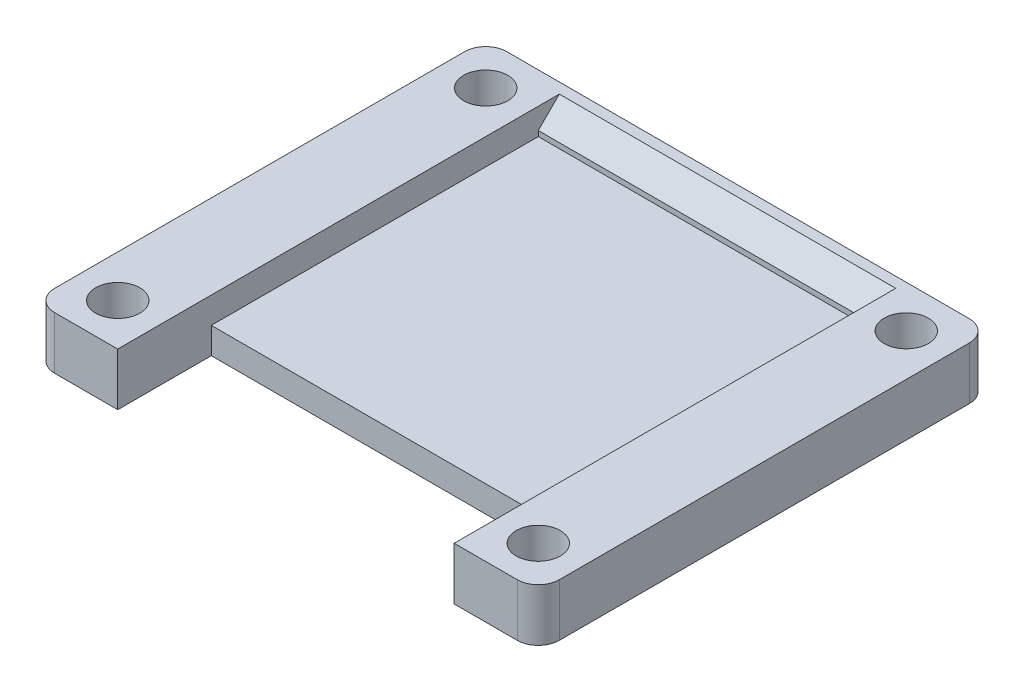
ISO-10303-21;
HEADER;
FILE_DESCRIPTION(('STEP AP214'),'2;1');
FILE_NAME('part.step','',(''),(''),'','','');
FILE_SCHEMA(('AUTOMOTIVE_DESIGN { 1 0 10303 214 1 1 1 1 }'));
ENDSEC;
DATA;
#1=APPLICATION_CONTEXT('core data for automotive mechanical design processes');
#2=APPLICATION_PROTOCOL_DEFINITION('international standard','automotive_design',2000,#1);
#3=PRODUCT_CONTEXT('',#1,'mechanical');
#4=PRODUCT('Part','Part','',(#3));
#5=PRODUCT_RELATED_PRODUCT_CATEGORY('part','',(#4));
#6=PRODUCT_DEFINITION_FORMATION('','',#4);
#7=PRODUCT_DEFINITION_CONTEXT('part definition',#1,'design');
#8=PRODUCT_DEFINITION('design','',#6,#7);
#9=PRODUCT_DEFINITION_SHAPE('','',#8);
#10=(LENGTH_UNIT() NAMED_UNIT(*) SI_UNIT(.MILLI.,.METRE.));
#11=(NAMED_UNIT(*) PLANE_ANGLE_UNIT() SI_UNIT($,.RADIAN.));
#12=(NAMED_UNIT(*) SI_UNIT($,.STERADIAN.) SOLID_ANGLE_UNIT());
#13=UNCERTAINTY_MEASURE_WITH_UNIT(LENGTH_MEASURE(1.E-05),#10,'distance_accuracy_value','');
#14=(GEOMETRIC_REPRESENTATION_CONTEXT(3) GLOBAL_UNCERTAINTY_ASSIGNED_CONTEXT((#13)) GLOBAL_UNIT_ASSIGNED_CONTEXT((#10,
#11,#12)) REPRESENTATION_CONTEXT('',''));
#15=CARTESIAN_POINT('',(0.,0.,0.));
#16=DIRECTION('',(0.,0.,1.));
#17=DIRECTION('',(1.,0.,0.));
#18=AXIS2_PLACEMENT_3D('',#15,#16,#17);
#19=CARTESIAN_POINT('',(-48.,-5.,0.));
#20=DIRECTION('',(0.,0.,1.));
#21=DIRECTION('',(1.,0.,0.));
#22=AXIS2_PLACEMENT_3D('',#19,#20,#21);
#23=PLANE('',#22);
#24=DIRECTION('',(1.,0.,0.));
#25=VECTOR('',#24,1.);
#26=CARTESIAN_POINT('',(-48.,-5.,0.));
#27=LINE('',#26,#25);
#28=CARTESIAN_POINT('',(-46.,-5.,0.));
#29=VERTEX_POINT('',#28);
#30=CARTESIAN_POINT('',(-40.,-5.,0.));
#31=VERTEX_POINT('',#30);
#32=EDGE_CURVE('E158',#29,#31,#27,.T.);
#33=ORIENTED_EDGE('',*,*,#32,.T.);
#34=DIRECTION('',(0.,1.,0.));
#35=VECTOR('',#34,1.);
#36=CARTESIAN_POINT('',(-40.,-2.5,0.));
#37=LINE('',#36,#35);
#38=CARTESIAN_POINT('',(-40.,0.,0.));
#39=VERTEX_POINT('',#38);
#40=EDGE_CURVE('E144',#31,#39,#37,.T.);
#41=ORIENTED_EDGE('',*,*,#40,.T.);
#42=DIRECTION('',(1.,0.,0.));
#43=VECTOR('',#42,1.);
#44=CARTESIAN_POINT('',(-48.,0.,0.));
#45=LINE('',#44,#43);
#46=CARTESIAN_POINT('',(-46.,0.,0.));
#47=VERTEX_POINT('',#46);
#48=EDGE_CURVE('E185',#47,#39,#45,.T.);
#49=ORIENTED_EDGE('',*,*,#48,.F.);
#50=DIRECTION('',(0.,1.,0.));
#51=VECTOR('',#50,1.);
#52=CARTESIAN_POINT('',(-46.,-5.,0.));
#53=LINE('',#52,#51);
#54=EDGE_CURVE('E167',#47,#29,#53,.F.);
#55=ORIENTED_EDGE('',*,*,#54,.T.);
#56=EDGE_LOOP('',(#33,#41,#49,#55));
#57=FACE_BOUND('',#56,.T.);
#58=ADVANCED_FACE('F37',(#57),#23,.T.);
#59=CARTESIAN_POINT('',(-48.,-5.,-43.));
#60=DIRECTION('',(-1.,0.,0.));
#61=DIRECTION('',(0.,0.,1.));
#62=AXIS2_PLACEMENT_3D('',#59,#60,#61);
#63=PLANE('',#62);
#64=DIRECTION('',(0.,0.,1.));
#65=VECTOR('',#64,1.);
#66=CARTESIAN_POINT('',(-48.,-5.,-43.));
#67=LINE('',#66,#65);
#68=CARTESIAN_POINT('',(-48.,-5.,-41.));
#69=VERTEX_POINT('',#68);
#70=CARTESIAN_POINT('',(-48.,-5.,-2.00000000000001));
#71=VERTEX_POINT('',#70);
#72=EDGE_CURVE('E174',#69,#71,#67,.T.);
#73=ORIENTED_EDGE('',*,*,#72,.T.);
#74=DIRECTION('',(0.,1.,0.));
#75=VECTOR('',#74,1.);
#76=CARTESIAN_POINT('',(-48.,-5.,-2.00000000000001));
#77=LINE('',#76,#75);
#78=CARTESIAN_POINT('',(-48.,0.,-2.00000000000001));
#79=VERTEX_POINT('',#78);
#80=EDGE_CURVE('E194',#71,#79,#77,.T.);
#81=ORIENTED_EDGE('',*,*,#80,.T.);
#82=DIRECTION('',(0.,0.,1.));
#83=VECTOR('',#82,1.);
#84=CARTESIAN_POINT('',(-48.,0.,-43.));
#85=LINE('',#84,#83);
#86=CARTESIAN_POINT('',(-48.,0.,-41.));
#87=VERTEX_POINT('',#86);
#88=EDGE_CURVE('E180',#87,#79,#85,.T.);
#89=ORIENTED_EDGE('',*,*,#88,.F.);
#90=DIRECTION('',(0.,1.,0.));
#91=VECTOR('',#90,1.);
#92=CARTESIAN_POINT('',(-48.,-5.,-41.));
#93=LINE('',#92,#91);
#94=EDGE_CURVE('E179',#87,#69,#93,.F.);
#95=ORIENTED_EDGE('',*,*,#94,.T.);
#96=EDGE_LOOP('',(#73,#81,#89,#95));
#97=FACE_BOUND('',#96,.T.);
#98=ADVANCED_FACE('F273',(#97),#63,.T.);
#99=CARTESIAN_POINT('',(-48.,-5.,-43.));
#100=DIRECTION('',(0.,0.,-1.));
#101=DIRECTION('',(-1.,0.,0.));
#102=AXIS2_PLACEMENT_3D('',#99,#100,#101);
#103=PLANE('',#102);
#104=DIRECTION('',(-1.,0.,0.));
#105=VECTOR('',#104,1.);
#106=CARTESIAN_POINT('',(-48.,0.,-43.));
#107=LINE('',#106,#105);
#108=CARTESIAN_POINT('',(-2.,0.,-43.));
#109=VERTEX_POINT('',#108);
#110=CARTESIAN_POINT('',(-46.,0.,-43.));
#111=VERTEX_POINT('',#110);
#112=EDGE_CURVE('E190',#109,#111,#107,.T.);
#113=ORIENTED_EDGE('',*,*,#112,.F.);
#114=DIRECTION('',(0.,1.,0.));
#115=VECTOR('',#114,1.);
#116=CARTESIAN_POINT('',(-2.,-5.,-43.));
#117=LINE('',#116,#115);
#118=CARTESIAN_POINT('',(-2.,-5.,-43.));
#119=VERTEX_POINT('',#118);
#120=EDGE_CURVE('E226',#109,#119,#117,.F.);
#121=ORIENTED_EDGE('',*,*,#120,.T.);
#122=DIRECTION('',(-1.,0.,0.));
#123=VECTOR('',#122,1.);
#124=CARTESIAN_POINT('',(-48.,-5.,-43.));
#125=LINE('',#124,#123);
#126=CARTESIAN_POINT('',(-46.,-5.,-43.));
#127=VERTEX_POINT('',#126);
#128=EDGE_CURVE('E172',#119,#127,#125,.T.);
#129=ORIENTED_EDGE('',*,*,#128,.T.);
#130=DIRECTION('',(0.,1.,0.));
#131=VECTOR('',#130,1.);
#132=CARTESIAN_POINT('',(-46.,-5.,-43.));
#133=LINE('',#132,#131);
#134=EDGE_CURVE('E223',#127,#111,#133,.T.);
#135=ORIENTED_EDGE('',*,*,#134,.T.);
#136=EDGE_LOOP('',(#113,#121,#129,#135));
#137=FACE_BOUND('',#136,.T.);
#138=ADVANCED_FACE('F263',(#137),#103,.T.);
#139=CARTESIAN_POINT('',(0.,-5.,-43.));
#140=DIRECTION('',(1.,0.,0.));
#141=DIRECTION('',(0.,0.,-1.));
#142=AXIS2_PLACEMENT_3D('',#139,#140,#141);
#143=PLANE('',#142);
#144=DIRECTION('',(0.,0.,-1.));
#145=VECTOR('',#144,1.);
#146=CARTESIAN_POINT('',(0.,0.,-43.));
#147=LINE('',#146,#145);
#148=CARTESIAN_POINT('',(0.,0.,-2.));
#149=VERTEX_POINT('',#148);
#150=CARTESIAN_POINT('',(0.,0.,-41.));
#151=VERTEX_POINT('',#150);
#152=EDGE_CURVE('E187',#149,#151,#147,.T.);
#153=ORIENTED_EDGE('',*,*,#152,.F.);
#154=DIRECTION('',(0.,1.,0.));
#155=VECTOR('',#154,1.);
#156=CARTESIAN_POINT('',(0.,-5.,-2.));
#157=LINE('',#156,#155);
#158=CARTESIAN_POINT('',(0.,-5.,-2.));
#159=VERTEX_POINT('',#158);
#160=EDGE_CURVE('E221',#149,#159,#157,.F.);
#161=ORIENTED_EDGE('',*,*,#160,.T.);
#162=DIRECTION('',(0.,0.,-1.));
#163=VECTOR('',#162,1.);
#164=CARTESIAN_POINT('',(0.,-5.,-43.));
#165=LINE('',#164,#163);
#166=CARTESIAN_POINT('',(0.,-5.,-41.));
#167=VERTEX_POINT('',#166);
#168=EDGE_CURVE('E168',#159,#167,#165,.T.);
#169=ORIENTED_EDGE('',*,*,#168,.T.);
#170=DIRECTION('',(0.,1.,0.));
#171=VECTOR('',#170,1.);
#172=CARTESIAN_POINT('',(0.,-5.,-41.));
#173=LINE('',#172,#171);
#174=EDGE_CURVE('E218',#167,#151,#173,.T.);
#175=ORIENTED_EDGE('',*,*,#174,.T.);
#176=EDGE_LOOP('',(#153,#161,#169,#175));
#177=FACE_BOUND('',#176,.T.);
#178=ADVANCED_FACE('F254',(#177),#143,.T.);
#179=DIRECTION('',(0.,1.,0.));
#180=VECTOR('',#179,1.);
#181=CARTESIAN_POINT('',(-7.99999999999999,-2.5,0.));
#182=LINE('',#181,#180);
#183=CARTESIAN_POINT('',(-8.,-5.,0.));
#184=VERTEX_POINT('',#183);
#185=CARTESIAN_POINT('',(-8.00000000000001,0.,0.));
#186=VERTEX_POINT('',#185);
#187=EDGE_CURVE('E152',#184,#186,#182,.T.);
#188=ORIENTED_EDGE('',*,*,#187,.F.);
#189=CARTESIAN_POINT('',(-2.00000000000002,-5.,0.));
#190=VERTEX_POINT('',#189);
#191=EDGE_CURVE('E169',#184,#190,#27,.T.);
#192=ORIENTED_EDGE('',*,*,#191,.T.);
#193=DIRECTION('',(0.,1.,0.));
#194=VECTOR('',#193,1.);
#195=CARTESIAN_POINT('',(-2.,-5.,0.));
#196=LINE('',#195,#194);
#197=CARTESIAN_POINT('',(-2.00000000000002,0.,0.));
#198=VERTEX_POINT('',#197);
#199=EDGE_CURVE('E205',#190,#198,#196,.T.);
#200=ORIENTED_EDGE('',*,*,#199,.T.);
#201=EDGE_CURVE('E183',#186,#198,#45,.T.);
#202=ORIENTED_EDGE('',*,*,#201,.F.);
#203=EDGE_LOOP('',(#188,#192,#200,#202));
#204=FACE_BOUND('',#203,.T.);
#205=ADVANCED_FACE('F244',(#204),#23,.T.);
#206=CARTESIAN_POINT('',(0.,-5.,0.));
#207=DIRECTION('',(0.,1.,0.));
#208=DIRECTION('',(0.,0.,1.));
#209=AXIS2_PLACEMENT_3D('',#206,#207,#208);
#210=PLANE('',#209);
#211=CARTESIAN_POINT('',(-44.,-5.,-4.00000000000001));
#212=DIRECTION('',(0.,1.,0.));
#213=DIRECTION('',(0.,0.,-1.));
#214=AXIS2_PLACEMENT_3D('',#211,#212,#213);
#215=CIRCLE('',#214,2.09999999999999);
#216=CARTESIAN_POINT('',(-44.,-5.,-6.1));
#217=VERTEX_POINT('',#216);
#218=EDGE_CURVE('E301',#217,#217,#215,.T.);
#219=ORIENTED_EDGE('',*,*,#218,.T.);
#220=EDGE_LOOP('',(#219));
#221=FACE_BOUND('',#220,.T.);
#222=CARTESIAN_POINT('',(-4.00000000000001,-5.,-3.99999999999999));
#223=DIRECTION('',(0.,1.,0.));
#224=DIRECTION('',(0.,0.,1.));
#225=AXIS2_PLACEMENT_3D('',#222,#223,#224);
#226=CIRCLE('',#225,2.1);
#227=CARTESIAN_POINT('',(-4.00000000000001,-5.,-1.89999999999999));
#228=VERTEX_POINT('',#227);
#229=EDGE_CURVE('E295',#228,#228,#226,.T.);
#230=ORIENTED_EDGE('',*,*,#229,.T.);
#231=EDGE_LOOP('',(#230));
#232=FACE_BOUND('',#231,.T.);
#233=CARTESIAN_POINT('',(-4.,-5.,-39.));
#234=DIRECTION('',(0.,1.,0.));
#235=DIRECTION('',(0.,0.,-1.));
#236=AXIS2_PLACEMENT_3D('',#233,#234,#235);
#237=CIRCLE('',#236,2.1);
#238=CARTESIAN_POINT('',(-4.,-5.,-41.1));
#239=VERTEX_POINT('',#238);
#240=EDGE_CURVE('E288',#239,#239,#237,.T.);
#241=ORIENTED_EDGE('',*,*,#240,.T.);
#242=EDGE_LOOP('',(#241));
#243=FACE_BOUND('',#242,.T.);
#244=CARTESIAN_POINT('',(-44.,-5.,-39.));
#245=DIRECTION('',(0.,1.,0.));
#246=DIRECTION('',(0.,0.,1.));
#247=AXIS2_PLACEMENT_3D('',#244,#245,#246);
#248=CIRCLE('',#247,2.1);
#249=CARTESIAN_POINT('',(-44.,-5.,-36.9));
#250=VERTEX_POINT('',#249);
#251=EDGE_CURVE('E306',#250,#250,#248,.T.);
#252=ORIENTED_EDGE('',*,*,#251,.T.);
#253=EDGE_LOOP('',(#252));
#254=FACE_BOUND('',#253,.T.);
#255=DIRECTION('',(-1.,0.,0.));
#256=VECTOR('',#255,1.);
#257=CARTESIAN_POINT('',(-40.,-5.,-8.9));
#258=LINE('',#257,#256);
#259=CARTESIAN_POINT('',(-7.99999999999999,-5.,-8.9));
#260=VERTEX_POINT('',#259);
#261=CARTESIAN_POINT('',(-40.,-5.,-8.9));
#262=VERTEX_POINT('',#261);
#263=EDGE_CURVE('E162',#260,#262,#258,.T.);
#264=ORIENTED_EDGE('',*,*,#263,.T.);
#265=DIRECTION('',(0.,0.,1.));
#266=VECTOR('',#265,1.);
#267=CARTESIAN_POINT('',(-40.,-5.,0.));
#268=LINE('',#267,#266);
#269=EDGE_CURVE('E147',#262,#31,#268,.T.);
#270=ORIENTED_EDGE('',*,*,#269,.T.);
#271=ORIENTED_EDGE('',*,*,#32,.F.);
#272=CARTESIAN_POINT('',(-46.,-5.,-2.00000000000001));
#273=DIRECTION('',(0.,1.,0.));
#274=DIRECTION('',(0.,0.,1.));
#275=AXIS2_PLACEMENT_3D('',#272,#273,#274);
#276=CIRCLE('',#275,2.);
#277=EDGE_CURVE('E216',#29,#71,#276,.F.);
#278=ORIENTED_EDGE('',*,*,#277,.T.);
#279=ORIENTED_EDGE('',*,*,#72,.F.);
#280=CARTESIAN_POINT('',(-46.,-5.,-41.));
#281=DIRECTION('',(0.,1.,0.));
#282=DIRECTION('',(0.,0.,1.));
#283=AXIS2_PLACEMENT_3D('',#280,#281,#282);
#284=CIRCLE('',#283,2.);
#285=EDGE_CURVE('E209',#69,#127,#284,.F.);
#286=ORIENTED_EDGE('',*,*,#285,.T.);
#287=ORIENTED_EDGE('',*,*,#128,.F.);
#288=CARTESIAN_POINT('',(-2.,-5.,-41.));
#289=DIRECTION('',(0.,1.,0.));
#290=DIRECTION('',(0.,0.,1.));
#291=AXIS2_PLACEMENT_3D('',#288,#289,#290);
#292=CIRCLE('',#291,2.);
#293=EDGE_CURVE('E211',#119,#167,#292,.F.);
#294=ORIENTED_EDGE('',*,*,#293,.T.);
#295=ORIENTED_EDGE('',*,*,#168,.F.);
#296=CARTESIAN_POINT('',(-2.,-5.,-2.));
#297=DIRECTION('',(0.,1.,0.));
#298=DIRECTION('',(0.,0.,1.));
#299=AXIS2_PLACEMENT_3D('',#296,#297,#298);
#300=CIRCLE('',#299,2.);
#301=EDGE_CURVE('E213',#159,#190,#300,.F.);
#302=ORIENTED_EDGE('',*,*,#301,.T.);
#303=ORIENTED_EDGE('',*,*,#191,.F.);
#304=DIRECTION('',(0.,0.,-1.));
#305=VECTOR('',#304,1.);
#306=CARTESIAN_POINT('',(-8.,-5.,0.));
#307=LINE('',#306,#305);
#308=EDGE_CURVE('E163',#184,#260,#307,.T.);
#309=ORIENTED_EDGE('',*,*,#308,.T.);
#310=EDGE_LOOP('',(#264,#270,#271,#278,#279,#286,#287,#294,#295,#302,#303,#309));
#311=FACE_BOUND('',#310,.T.);
#312=ADVANCED_FACE('F157',(#221,#232,#243,#254,#311),#210,.F.);
#313=CARTESIAN_POINT('',(0.,0.,0.));
#314=DIRECTION('',(0.,1.,0.));
#315=DIRECTION('',(0.,0.,1.));
#316=AXIS2_PLACEMENT_3D('',#313,#314,#315);
#317=PLANE('',#316);
#318=CARTESIAN_POINT('',(-44.,0.,-4.00000000000001));
#319=DIRECTION('',(0.,1.,0.));
#320=DIRECTION('',(0.,0.,-1.));
#321=AXIS2_PLACEMENT_3D('',#318,#319,#320);
#322=CIRCLE('',#321,2.09999999999999);
#323=CARTESIAN_POINT('',(-44.,0.,-6.1));
#324=VERTEX_POINT('',#323);
#325=EDGE_CURVE('E286',#324,#324,#322,.T.);
#326=ORIENTED_EDGE('',*,*,#325,.F.);
#327=EDGE_LOOP('',(#326));
#328=FACE_BOUND('',#327,.T.);
#329=CARTESIAN_POINT('',(-4.00000000000001,0.,-3.99999999999999));
#330=DIRECTION('',(0.,1.,0.));
#331=DIRECTION('',(0.,0.,1.));
#332=AXIS2_PLACEMENT_3D('',#329,#330,#331);
#333=CIRCLE('',#332,2.1);
#334=CARTESIAN_POINT('',(-4.00000000000001,0.,-1.89999999999999));
#335=VERTEX_POINT('',#334);
#336=EDGE_CURVE('E298',#335,#335,#333,.T.);
#337=ORIENTED_EDGE('',*,*,#336,.F.);
#338=EDGE_LOOP('',(#337));
#339=FACE_BOUND('',#338,.T.);
#340=CARTESIAN_POINT('',(-4.,0.,-39.));
#341=DIRECTION('',(0.,1.,0.));
#342=DIRECTION('',(0.,0.,-1.));
#343=AXIS2_PLACEMENT_3D('',#340,#341,#342);
#344=CIRCLE('',#343,2.1);
#345=CARTESIAN_POINT('',(-4.,0.,-41.1));
#346=VERTEX_POINT('',#345);
#347=EDGE_CURVE('E292',#346,#346,#344,.T.);
#348=ORIENTED_EDGE('',*,*,#347,.F.);
#349=EDGE_LOOP('',(#348));
#350=FACE_BOUND('',#349,.T.);
#351=CARTESIAN_POINT('',(-44.,0.,-39.));
#352=DIRECTION('',(0.,1.,0.));
#353=DIRECTION('',(0.,0.,1.));
#354=AXIS2_PLACEMENT_3D('',#351,#352,#353);
#355=CIRCLE('',#354,2.1);
#356=CARTESIAN_POINT('',(-44.,0.,-36.9));
#357=VERTEX_POINT('',#356);
#358=EDGE_CURVE('E291',#357,#357,#355,.T.);
#359=ORIENTED_EDGE('',*,*,#358,.F.);
#360=EDGE_LOOP('',(#359));
#361=FACE_BOUND('',#360,.T.);
#362=DIRECTION('',(0.,0.,1.));
#363=VECTOR('',#362,1.);
#364=CARTESIAN_POINT('',(-40.,0.,-40.));
#365=LINE('',#364,#363);
#366=CARTESIAN_POINT('',(-40.,0.,-42.));
#367=VERTEX_POINT('',#366);
#368=EDGE_CURVE('E53',#367,#39,#365,.T.);
#369=ORIENTED_EDGE('',*,*,#368,.F.);
#370=DIRECTION('',(1.,0.,0.));
#371=VECTOR('',#370,1.);
#372=CARTESIAN_POINT('',(-8.00000000000001,0.,-42.));
#373=LINE('',#372,#371);
#374=CARTESIAN_POINT('',(-8.00000000000001,0.,-42.));
#375=VERTEX_POINT('',#374);
#376=EDGE_CURVE('E231',#367,#375,#373,.T.);
#377=ORIENTED_EDGE('',*,*,#376,.T.);
#378=DIRECTION('',(0.,0.,-1.));
#379=VECTOR('',#378,1.);
#380=CARTESIAN_POINT('',(-8.00000000000001,0.,-40.));
#381=LINE('',#380,#379);
#382=EDGE_CURVE('E60',#186,#375,#381,.T.);
#383=ORIENTED_EDGE('',*,*,#382,.F.);
#384=ORIENTED_EDGE('',*,*,#201,.T.);
#385=CARTESIAN_POINT('',(-2.,0.,-2.));
#386=DIRECTION('',(0.,1.,0.));
#387=DIRECTION('',(0.,0.,1.));
#388=AXIS2_PLACEMENT_3D('',#385,#386,#387);
#389=CIRCLE('',#388,2.);
#390=EDGE_CURVE('E201',#198,#149,#389,.T.);
#391=ORIENTED_EDGE('',*,*,#390,.T.);
#392=ORIENTED_EDGE('',*,*,#152,.T.);
#393=CARTESIAN_POINT('',(-2.,0.,-41.));
#394=DIRECTION('',(0.,1.,0.));
#395=DIRECTION('',(0.,0.,1.));
#396=AXIS2_PLACEMENT_3D('',#393,#394,#395);
#397=CIRCLE('',#396,2.);
#398=EDGE_CURVE('E199',#151,#109,#397,.T.);
#399=ORIENTED_EDGE('',*,*,#398,.T.);
#400=ORIENTED_EDGE('',*,*,#112,.T.);
#401=CARTESIAN_POINT('',(-46.,0.,-41.));
#402=DIRECTION('',(0.,1.,0.));
#403=DIRECTION('',(0.,0.,1.));
#404=AXIS2_PLACEMENT_3D('',#401,#402,#403);
#405=CIRCLE('',#404,2.);
#406=EDGE_CURVE('E197',#111,#87,#405,.T.);
#407=ORIENTED_EDGE('',*,*,#406,.T.);
#408=ORIENTED_EDGE('',*,*,#88,.T.);
#409=CARTESIAN_POINT('',(-46.,0.,-2.00000000000001));
#410=DIRECTION('',(0.,1.,0.));
#411=DIRECTION('',(0.,0.,1.));
#412=AXIS2_PLACEMENT_3D('',#409,#410,#411);
#413=CIRCLE('',#412,2.);
#414=EDGE_CURVE('E203',#79,#47,#413,.T.);
#415=ORIENTED_EDGE('',*,*,#414,.T.);
#416=ORIENTED_EDGE('',*,*,#48,.T.);
#417=EDGE_LOOP('',(#369,#377,#383,#384,#391,#392,#399,#400,#407,#408,#415,#416));
#418=FACE_BOUND('',#417,.T.);
#419=ADVANCED_FACE('F238',(#328,#339,#350,#361,#418),#317,.T.);
#420=CARTESIAN_POINT('',(-40.,-2.5,-40.));
#421=DIRECTION('',(-1.,0.,0.));
#422=DIRECTION('',(0.,0.,1.));
#423=AXIS2_PLACEMENT_3D('',#420,#421,#422);
#424=PLANE('',#423);
#425=ORIENTED_EDGE('',*,*,#368,.T.);
#426=ORIENTED_EDGE('',*,*,#40,.F.);
#427=ORIENTED_EDGE('',*,*,#269,.F.);
#428=DIRECTION('',(0.,1.,0.));
#429=VECTOR('',#428,1.);
#430=CARTESIAN_POINT('',(-40.,-5.,-8.9));
#431=LINE('',#430,#429);
#432=CARTESIAN_POINT('',(-40.,-2.5,-8.9));
#433=VERTEX_POINT('',#432);
#434=EDGE_CURVE('E284',#262,#433,#431,.T.);
#435=ORIENTED_EDGE('',*,*,#434,.T.);
#436=DIRECTION('',(0.,0.,1.));
#437=VECTOR('',#436,1.);
#438=CARTESIAN_POINT('',(-40.,-2.5,-40.));
#439=LINE('',#438,#437);
#440=CARTESIAN_POINT('',(-40.,-2.5,-40.));
#441=VERTEX_POINT('',#440);
#442=EDGE_CURVE('E241',#441,#433,#439,.T.);
#443=ORIENTED_EDGE('',*,*,#442,.F.);
#444=DIRECTION('',(0.,1.,0.));
#445=VECTOR('',#444,1.);
#446=CARTESIAN_POINT('',(-40.,-2.5,-40.));
#447=LINE('',#446,#445);
#448=CARTESIAN_POINT('',(-40.,-2.00000000000001,-40.));
#449=VERTEX_POINT('',#448);
#450=EDGE_CURVE('E184',#441,#449,#447,.T.);
#451=ORIENTED_EDGE('',*,*,#450,.T.);
#452=DIRECTION('',(0.,0.707106781186546,-0.707106781186549));
#453=VECTOR('',#452,1.);
#454=CARTESIAN_POINT('',(-40.,-2.25,-39.75));
#455=LINE('',#454,#453);
#456=EDGE_CURVE('E46',#449,#367,#455,.T.);
#457=ORIENTED_EDGE('',*,*,#456,.T.);
#458=EDGE_LOOP('',(#425,#426,#427,#435,#443,#451,#457));
#459=FACE_BOUND('',#458,.T.);
#460=ADVANCED_FACE('F146',(#459),#424,.F.);
#461=CARTESIAN_POINT('',(-40.,-2.5,-40.));
#462=DIRECTION('',(0.,0.,-1.));
#463=DIRECTION('',(-1.,0.,0.));
#464=AXIS2_PLACEMENT_3D('',#461,#462,#463);
#465=PLANE('',#464);
#466=DIRECTION('',(0.,1.,0.));
#467=VECTOR('',#466,1.);
#468=CARTESIAN_POINT('',(-8.00000000000001,-2.5,-40.));
#469=LINE('',#468,#467);
#470=CARTESIAN_POINT('',(-8.00000000000001,-2.5,-40.));
#471=VERTEX_POINT('',#470);
#472=CARTESIAN_POINT('',(-8.00000000000001,-2.00000000000001,-40.));
#473=VERTEX_POINT('',#472);
#474=EDGE_CURVE('E319',#471,#473,#469,.T.);
#475=ORIENTED_EDGE('',*,*,#474,.T.);
#476=DIRECTION('',(-1.,0.,0.));
#477=VECTOR('',#476,1.);
#478=CARTESIAN_POINT('',(-40.,-2.00000000000001,-40.));
#479=LINE('',#478,#477);
#480=EDGE_CURVE('E228',#473,#449,#479,.T.);
#481=ORIENTED_EDGE('',*,*,#480,.T.);
#482=ORIENTED_EDGE('',*,*,#450,.F.);
#483=DIRECTION('',(-1.,0.,0.));
#484=VECTOR('',#483,1.);
#485=CARTESIAN_POINT('',(-40.,-2.5,-40.));
#486=LINE('',#485,#484);
#487=EDGE_CURVE('E153',#471,#441,#486,.T.);
#488=ORIENTED_EDGE('',*,*,#487,.F.);
#489=EDGE_LOOP('',(#475,#481,#482,#488));
#490=FACE_BOUND('',#489,.T.);
#491=ADVANCED_FACE('F325',(#490),#465,.F.);
#492=CARTESIAN_POINT('',(-8.00000000000001,-2.5,-40.));
#493=DIRECTION('',(1.,0.,0.));
#494=DIRECTION('',(0.,0.,-1.));
#495=AXIS2_PLACEMENT_3D('',#492,#493,#494);
#496=PLANE('',#495);
#497=ORIENTED_EDGE('',*,*,#382,.T.);
#498=DIRECTION('',(0.,-0.707106781186546,0.707106781186549));
#499=VECTOR('',#498,1.);
#500=CARTESIAN_POINT('',(-8.00000000000001,-2.25,-39.75));
#501=LINE('',#500,#499);
#502=EDGE_CURVE('E11',#375,#473,#501,.T.);
#503=ORIENTED_EDGE('',*,*,#502,.T.);
#504=ORIENTED_EDGE('',*,*,#474,.F.);
#505=DIRECTION('',(0.,0.,-1.));
#506=VECTOR('',#505,1.);
#507=CARTESIAN_POINT('',(-8.00000000000001,-2.5,-40.));
#508=LINE('',#507,#506);
#509=CARTESIAN_POINT('',(-7.99999999999999,-2.5,-8.9));
#510=VERTEX_POINT('',#509);
#511=EDGE_CURVE('E313',#510,#471,#508,.T.);
#512=ORIENTED_EDGE('',*,*,#511,.F.);
#513=DIRECTION('',(0.,1.,0.));
#514=VECTOR('',#513,1.);
#515=CARTESIAN_POINT('',(-7.99999999999999,-5.,-8.9));
#516=LINE('',#515,#514);
#517=EDGE_CURVE('E279',#260,#510,#516,.T.);
#518=ORIENTED_EDGE('',*,*,#517,.F.);
#519=ORIENTED_EDGE('',*,*,#308,.F.);
#520=ORIENTED_EDGE('',*,*,#187,.T.);
#521=EDGE_LOOP('',(#497,#503,#504,#512,#518,#519,#520));
#522=FACE_BOUND('',#521,.T.);
#523=ADVANCED_FACE('F322',(#522),#496,.F.);
#524=CARTESIAN_POINT('',(0.,-2.5,0.));
#525=DIRECTION('',(0.,1.,0.));
#526=DIRECTION('',(0.,0.,1.));
#527=AXIS2_PLACEMENT_3D('',#524,#525,#526);
#528=PLANE('',#527);
#529=DIRECTION('',(-1.,0.,0.));
#530=VECTOR('',#529,1.);
#531=CARTESIAN_POINT('',(-40.,-2.5,-8.9));
#532=LINE('',#531,#530);
#533=EDGE_CURVE('E164',#510,#433,#532,.T.);
#534=ORIENTED_EDGE('',*,*,#533,.F.);
#535=ORIENTED_EDGE('',*,*,#511,.T.);
#536=ORIENTED_EDGE('',*,*,#487,.T.);
#537=ORIENTED_EDGE('',*,*,#442,.T.);
#538=EDGE_LOOP('',(#534,#535,#536,#537));
#539=FACE_BOUND('',#538,.T.);
#540=ADVANCED_FACE('F324',(#539),#528,.T.);
#541=CARTESIAN_POINT('',(-44.,-5.,-39.));
#542=DIRECTION('',(0.,1.,0.));
#543=DIRECTION('',(0.,0.,1.));
#544=AXIS2_PLACEMENT_3D('',#541,#542,#543);
#545=CYLINDRICAL_SURFACE('',#544,2.1);
#546=ORIENTED_EDGE('',*,*,#251,.F.);
#547=EDGE_LOOP('',(#546));
#548=FACE_BOUND('',#547,.T.);
#549=ORIENTED_EDGE('',*,*,#358,.T.);
#550=EDGE_LOOP('',(#549));
#551=FACE_BOUND('',#550,.T.);
#552=ADVANCED_FACE('F331',(#548,#551),#545,.F.);
#553=CARTESIAN_POINT('',(-4.,-5.,-39.));
#554=DIRECTION('',(0.,1.,0.));
#555=DIRECTION('',(0.,0.,1.));
#556=AXIS2_PLACEMENT_3D('',#553,#554,#555);
#557=CYLINDRICAL_SURFACE('',#556,2.1);
#558=ORIENTED_EDGE('',*,*,#240,.F.);
#559=EDGE_LOOP('',(#558));
#560=FACE_BOUND('',#559,.T.);
#561=ORIENTED_EDGE('',*,*,#347,.T.);
#562=EDGE_LOOP('',(#561));
#563=FACE_BOUND('',#562,.T.);
#564=ADVANCED_FACE('F433',(#560,#563),#557,.F.);
#565=CARTESIAN_POINT('',(-4.00000000000001,-5.,-3.99999999999999));
#566=DIRECTION('',(0.,1.,0.));
#567=DIRECTION('',(0.,0.,1.));
#568=AXIS2_PLACEMENT_3D('',#565,#566,#567);
#569=CYLINDRICAL_SURFACE('',#568,2.1);
#570=ORIENTED_EDGE('',*,*,#229,.F.);
#571=EDGE_LOOP('',(#570));
#572=FACE_BOUND('',#571,.T.);
#573=ORIENTED_EDGE('',*,*,#336,.T.);
#574=EDGE_LOOP('',(#573));
#575=FACE_BOUND('',#574,.T.);
#576=ADVANCED_FACE('F440',(#572,#575),#569,.F.);
#577=CARTESIAN_POINT('',(-44.,-5.,-4.00000000000001));
#578=DIRECTION('',(0.,1.,0.));
#579=DIRECTION('',(0.,0.,1.));
#580=AXIS2_PLACEMENT_3D('',#577,#578,#579);
#581=CYLINDRICAL_SURFACE('',#580,2.09999999999999);
#582=ORIENTED_EDGE('',*,*,#218,.F.);
#583=EDGE_LOOP('',(#582));
#584=FACE_BOUND('',#583,.T.);
#585=ORIENTED_EDGE('',*,*,#325,.T.);
#586=EDGE_LOOP('',(#585));
#587=FACE_BOUND('',#586,.T.);
#588=ADVANCED_FACE('F448',(#584,#587),#581,.F.);
#589=CARTESIAN_POINT('',(-46.,-5.,-2.00000000000001));
#590=DIRECTION('',(0.,1.,0.));
#591=DIRECTION('',(0.,0.,1.));
#592=AXIS2_PLACEMENT_3D('',#589,#590,#591);
#593=CYLINDRICAL_SURFACE('',#592,2.);
#594=ORIENTED_EDGE('',*,*,#277,.F.);
#595=ORIENTED_EDGE('',*,*,#54,.F.);
#596=ORIENTED_EDGE('',*,*,#414,.F.);
#597=ORIENTED_EDGE('',*,*,#80,.F.);
#598=EDGE_LOOP('',(#594,#595,#596,#597));
#599=FACE_BOUND('',#598,.T.);
#600=ADVANCED_FACE('F277',(#599),#593,.T.);
#601=CARTESIAN_POINT('',(-2.,-5.,-2.));
#602=DIRECTION('',(0.,1.,0.));
#603=DIRECTION('',(0.,0.,1.));
#604=AXIS2_PLACEMENT_3D('',#601,#602,#603);
#605=CYLINDRICAL_SURFACE('',#604,2.);
#606=ORIENTED_EDGE('',*,*,#301,.F.);
#607=ORIENTED_EDGE('',*,*,#160,.F.);
#608=ORIENTED_EDGE('',*,*,#390,.F.);
#609=ORIENTED_EDGE('',*,*,#199,.F.);
#610=EDGE_LOOP('',(#606,#607,#608,#609));
#611=FACE_BOUND('',#610,.T.);
#612=ADVANCED_FACE('F250',(#611),#605,.T.);
#613=CARTESIAN_POINT('',(-2.,-5.,-41.));
#614=DIRECTION('',(0.,1.,0.));
#615=DIRECTION('',(0.,0.,1.));
#616=AXIS2_PLACEMENT_3D('',#613,#614,#615);
#617=CYLINDRICAL_SURFACE('',#616,2.);
#618=ORIENTED_EDGE('',*,*,#293,.F.);
#619=ORIENTED_EDGE('',*,*,#120,.F.);
#620=ORIENTED_EDGE('',*,*,#398,.F.);
#621=ORIENTED_EDGE('',*,*,#174,.F.);
#622=EDGE_LOOP('',(#618,#619,#620,#621));
#623=FACE_BOUND('',#622,.T.);
#624=ADVANCED_FACE('F259',(#623),#617,.T.);
#625=CARTESIAN_POINT('',(-46.,-5.,-41.));
#626=DIRECTION('',(0.,1.,0.));
#627=DIRECTION('',(0.,0.,1.));
#628=AXIS2_PLACEMENT_3D('',#625,#626,#627);
#629=CYLINDRICAL_SURFACE('',#628,2.);
#630=ORIENTED_EDGE('',*,*,#285,.F.);
#631=ORIENTED_EDGE('',*,*,#94,.F.);
#632=ORIENTED_EDGE('',*,*,#406,.F.);
#633=ORIENTED_EDGE('',*,*,#134,.F.);
#634=EDGE_LOOP('',(#630,#631,#632,#633));
#635=FACE_BOUND('',#634,.T.);
#636=ADVANCED_FACE('F268',(#635),#629,.T.);
#637=CARTESIAN_POINT('',(-40.,-2.00000000000001,-40.));
#638=DIRECTION('',(0.,0.707106781186549,0.707106781186546));
#639=DIRECTION('',(1.,0.,0.));
#640=AXIS2_PLACEMENT_3D('',#637,#638,#639);
#641=PLANE('',#640);
#642=ORIENTED_EDGE('',*,*,#502,.F.);
#643=ORIENTED_EDGE('',*,*,#376,.F.);
#644=ORIENTED_EDGE('',*,*,#456,.F.);
#645=ORIENTED_EDGE('',*,*,#480,.F.);
#646=EDGE_LOOP('',(#642,#643,#644,#645));
#647=FACE_BOUND('',#646,.T.);
#648=ADVANCED_FACE('F40',(#647),#641,.T.);
#649=CARTESIAN_POINT('',(-40.,-5.,-8.9));
#650=DIRECTION('',(0.,0.,-1.));
#651=DIRECTION('',(-1.,0.,0.));
#652=AXIS2_PLACEMENT_3D('',#649,#650,#651);
#653=PLANE('',#652);
#654=ORIENTED_EDGE('',*,*,#533,.T.);
#655=ORIENTED_EDGE('',*,*,#434,.F.);
#656=ORIENTED_EDGE('',*,*,#263,.F.);
#657=ORIENTED_EDGE('',*,*,#517,.T.);
#658=EDGE_LOOP('',(#654,#655,#656,#657));
#659=FACE_BOUND('',#658,.T.);
#660=ADVANCED_FACE('F381',(#659),#653,.F.);
#661=CLOSED_SHELL('',(#58,#98,#138,#178,#205,#312,#419,#460,#491,#523,#540,#552,#564,#576,#588,
#600,#612,#624,#636,#648,#660));
#662=MANIFOLD_SOLID_BREP('B2',#661);
#663=ADVANCED_BREP_SHAPE_REPRESENTATION('',(#18,#662),#14);
#664=SHAPE_DEFINITION_REPRESENTATION(#9,#663);
ENDSEC;
END-ISO-10303-21;
